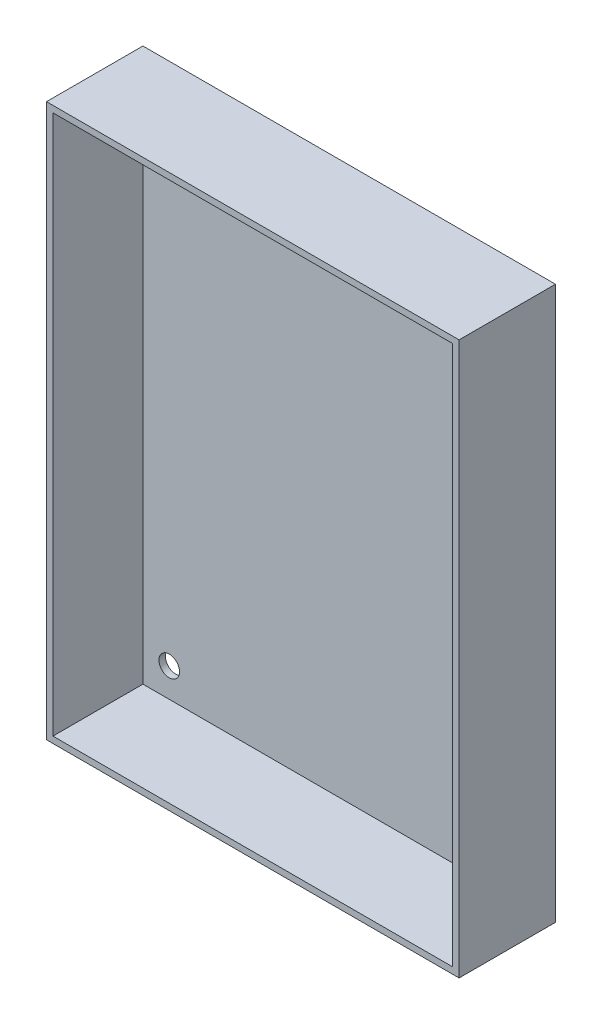
ISO-10303-21;
HEADER;
FILE_DESCRIPTION(('STEP AP214'),'2;1');
FILE_NAME('part.step','',(''),(''),'','','');
FILE_SCHEMA(('AUTOMOTIVE_DESIGN { 1 0 10303 214 1 1 1 1 }'));
ENDSEC;
DATA;
#1=APPLICATION_CONTEXT('core data for automotive mechanical design processes');
#2=APPLICATION_PROTOCOL_DEFINITION('international standard','automotive_design',2000,#1);
#3=PRODUCT_CONTEXT('',#1,'mechanical');
#4=PRODUCT('Part','Part','',(#3));
#5=PRODUCT_RELATED_PRODUCT_CATEGORY('part','',(#4));
#6=PRODUCT_DEFINITION_FORMATION('','',#4);
#7=PRODUCT_DEFINITION_CONTEXT('part definition',#1,'design');
#8=PRODUCT_DEFINITION('design','',#6,#7);
#9=PRODUCT_DEFINITION_SHAPE('','',#8);
#10=(LENGTH_UNIT() NAMED_UNIT(*) SI_UNIT(.MILLI.,.METRE.));
#11=(NAMED_UNIT(*) PLANE_ANGLE_UNIT() SI_UNIT($,.RADIAN.));
#12=(NAMED_UNIT(*) SI_UNIT($,.STERADIAN.) SOLID_ANGLE_UNIT());
#13=UNCERTAINTY_MEASURE_WITH_UNIT(LENGTH_MEASURE(1.E-05),#10,'distance_accuracy_value','');
#14=(GEOMETRIC_REPRESENTATION_CONTEXT(3) GLOBAL_UNCERTAINTY_ASSIGNED_CONTEXT((#13)) GLOBAL_UNIT_ASSIGNED_CONTEXT((#10,
#11,#12)) REPRESENTATION_CONTEXT('',''));
#15=CARTESIAN_POINT('',(0.,0.,0.));
#16=DIRECTION('',(0.,0.,1.));
#17=DIRECTION('',(1.,0.,0.));
#18=AXIS2_PLACEMENT_3D('',#15,#16,#17);
#19=CARTESIAN_POINT('',(-32.1,-43.,15.));
#20=DIRECTION('',(1.,0.,0.));
#21=DIRECTION('',(0.,0.,-1.));
#22=AXIS2_PLACEMENT_3D('',#19,#20,#21);
#23=PLANE('',#22);
#24=DIRECTION('',(0.,-1.,0.));
#25=VECTOR('',#24,1.);
#26=CARTESIAN_POINT('',(-32.1,-43.,0.));
#27=LINE('',#26,#25);
#28=CARTESIAN_POINT('',(-32.1,43.,0.));
#29=VERTEX_POINT('',#28);
#30=CARTESIAN_POINT('',(-32.1,-43.,0.));
#31=VERTEX_POINT('',#30);
#32=EDGE_CURVE('E147',#29,#31,#27,.T.);
#33=ORIENTED_EDGE('',*,*,#32,.T.);
#34=DIRECTION('',(0.,0.,-1.));
#35=VECTOR('',#34,1.);
#36=CARTESIAN_POINT('',(-32.1,-43.,15.));
#37=LINE('',#36,#35);
#38=CARTESIAN_POINT('',(-32.1,-43.,15.));
#39=VERTEX_POINT('',#38);
#40=EDGE_CURVE('E11',#39,#31,#37,.T.);
#41=ORIENTED_EDGE('',*,*,#40,.F.);
#42=DIRECTION('',(0.,-1.,0.));
#43=VECTOR('',#42,1.);
#44=CARTESIAN_POINT('',(-32.1,-43.,15.));
#45=LINE('',#44,#43);
#46=CARTESIAN_POINT('',(-32.1,43.,15.));
#47=VERTEX_POINT('',#46);
#48=EDGE_CURVE('E151',#47,#39,#45,.T.);
#49=ORIENTED_EDGE('',*,*,#48,.F.);
#50=DIRECTION('',(0.,0.,-1.));
#51=VECTOR('',#50,1.);
#52=CARTESIAN_POINT('',(-32.1,43.,15.));
#53=LINE('',#52,#51);
#54=EDGE_CURVE('E157',#47,#29,#53,.T.);
#55=ORIENTED_EDGE('',*,*,#54,.T.);
#56=EDGE_LOOP('',(#33,#41,#49,#55));
#57=FACE_BOUND('',#56,.T.);
#58=ADVANCED_FACE('F35',(#57),#23,.F.);
#59=CARTESIAN_POINT('',(32.1,-43.,15.));
#60=DIRECTION('',(0.,1.,0.));
#61=DIRECTION('',(-1.,0.,0.));
#62=AXIS2_PLACEMENT_3D('',#59,#60,#61);
#63=PLANE('',#62);
#64=DIRECTION('',(1.,0.,0.));
#65=VECTOR('',#64,1.);
#66=CARTESIAN_POINT('',(32.1,-43.,0.));
#67=LINE('',#66,#65);
#68=CARTESIAN_POINT('',(32.1,-43.,0.));
#69=VERTEX_POINT('',#68);
#70=EDGE_CURVE('E160',#31,#69,#67,.T.);
#71=ORIENTED_EDGE('',*,*,#70,.T.);
#72=DIRECTION('',(0.,0.,-1.));
#73=VECTOR('',#72,1.);
#74=CARTESIAN_POINT('',(32.1,-43.,15.));
#75=LINE('',#74,#73);
#76=CARTESIAN_POINT('',(32.1,-43.,15.));
#77=VERTEX_POINT('',#76);
#78=EDGE_CURVE('E42',#77,#69,#75,.T.);
#79=ORIENTED_EDGE('',*,*,#78,.F.);
#80=DIRECTION('',(1.,0.,0.));
#81=VECTOR('',#80,1.);
#82=CARTESIAN_POINT('',(32.1,-43.,15.));
#83=LINE('',#82,#81);
#84=EDGE_CURVE('E86',#39,#77,#83,.T.);
#85=ORIENTED_EDGE('',*,*,#84,.F.);
#86=ORIENTED_EDGE('',*,*,#40,.T.);
#87=EDGE_LOOP('',(#71,#79,#85,#86));
#88=FACE_BOUND('',#87,.T.);
#89=ADVANCED_FACE('F189',(#88),#63,.F.);
#90=CARTESIAN_POINT('',(32.1,-43.,15.));
#91=DIRECTION('',(-1.,0.,0.));
#92=DIRECTION('',(0.,0.,1.));
#93=AXIS2_PLACEMENT_3D('',#90,#91,#92);
#94=PLANE('',#93);
#95=DIRECTION('',(0.,1.,0.));
#96=VECTOR('',#95,1.);
#97=CARTESIAN_POINT('',(32.1,-43.,0.));
#98=LINE('',#97,#96);
#99=CARTESIAN_POINT('',(32.1,43.,0.));
#100=VERTEX_POINT('',#99);
#101=EDGE_CURVE('E162',#69,#100,#98,.T.);
#102=ORIENTED_EDGE('',*,*,#101,.T.);
#103=DIRECTION('',(0.,0.,-1.));
#104=VECTOR('',#103,1.);
#105=CARTESIAN_POINT('',(32.1,43.,15.));
#106=LINE('',#105,#104);
#107=CARTESIAN_POINT('',(32.1,43.,15.));
#108=VERTEX_POINT('',#107);
#109=EDGE_CURVE('E166',#108,#100,#106,.T.);
#110=ORIENTED_EDGE('',*,*,#109,.F.);
#111=DIRECTION('',(0.,1.,0.));
#112=VECTOR('',#111,1.);
#113=CARTESIAN_POINT('',(32.1,-43.,15.));
#114=LINE('',#113,#112);
#115=EDGE_CURVE('E154',#77,#108,#114,.T.);
#116=ORIENTED_EDGE('',*,*,#115,.F.);
#117=ORIENTED_EDGE('',*,*,#78,.T.);
#118=EDGE_LOOP('',(#102,#110,#116,#117));
#119=FACE_BOUND('',#118,.T.);
#120=ADVANCED_FACE('F171',(#119),#94,.F.);
#121=CARTESIAN_POINT('',(32.1,43.,15.));
#122=DIRECTION('',(0.,-1.,0.));
#123=DIRECTION('',(1.,0.,0.));
#124=AXIS2_PLACEMENT_3D('',#121,#122,#123);
#125=PLANE('',#124);
#126=DIRECTION('',(-1.,0.,0.));
#127=VECTOR('',#126,1.);
#128=CARTESIAN_POINT('',(32.1,43.,0.));
#129=LINE('',#128,#127);
#130=EDGE_CURVE('E79',#100,#29,#129,.T.);
#131=ORIENTED_EDGE('',*,*,#130,.T.);
#132=ORIENTED_EDGE('',*,*,#54,.F.);
#133=DIRECTION('',(-1.,0.,0.));
#134=VECTOR('',#133,1.);
#135=CARTESIAN_POINT('',(32.1,43.,15.));
#136=LINE('',#135,#134);
#137=EDGE_CURVE('E58',#108,#47,#136,.T.);
#138=ORIENTED_EDGE('',*,*,#137,.F.);
#139=ORIENTED_EDGE('',*,*,#109,.T.);
#140=EDGE_LOOP('',(#131,#132,#138,#139));
#141=FACE_BOUND('',#140,.T.);
#142=ADVANCED_FACE('F179',(#141),#125,.F.);
#143=CARTESIAN_POINT('',(0.,0.,15.));
#144=DIRECTION('',(0.,0.,1.));
#145=DIRECTION('',(1.,0.,0.));
#146=AXIS2_PLACEMENT_3D('',#143,#144,#145);
#147=PLANE('',#146);
#148=DIRECTION('',(0.,-1.,0.));
#149=VECTOR('',#148,1.);
#150=CARTESIAN_POINT('',(-31.1,-42.,15.));
#151=LINE('',#150,#149);
#152=CARTESIAN_POINT('',(-31.1,42.,15.));
#153=VERTEX_POINT('',#152);
#154=CARTESIAN_POINT('',(-31.1,-42.,15.));
#155=VERTEX_POINT('',#154);
#156=EDGE_CURVE('E49',#153,#155,#151,.T.);
#157=ORIENTED_EDGE('',*,*,#156,.F.);
#158=DIRECTION('',(-1.,0.,0.));
#159=VECTOR('',#158,1.);
#160=CARTESIAN_POINT('',(31.1,42.,15.));
#161=LINE('',#160,#159);
#162=CARTESIAN_POINT('',(31.1,42.,15.));
#163=VERTEX_POINT('',#162);
#164=EDGE_CURVE('E128',#163,#153,#161,.T.);
#165=ORIENTED_EDGE('',*,*,#164,.F.);
#166=DIRECTION('',(0.,1.,0.));
#167=VECTOR('',#166,1.);
#168=CARTESIAN_POINT('',(31.1,-42.,15.));
#169=LINE('',#168,#167);
#170=CARTESIAN_POINT('',(31.1,-42.,15.));
#171=VERTEX_POINT('',#170);
#172=EDGE_CURVE('E131',#171,#163,#169,.T.);
#173=ORIENTED_EDGE('',*,*,#172,.F.);
#174=DIRECTION('',(1.,0.,0.));
#175=VECTOR('',#174,1.);
#176=CARTESIAN_POINT('',(31.1,-42.,15.));
#177=LINE('',#176,#175);
#178=EDGE_CURVE('E140',#155,#171,#177,.T.);
#179=ORIENTED_EDGE('',*,*,#178,.F.);
#180=EDGE_LOOP('',(#157,#165,#173,#179));
#181=FACE_BOUND('',#180,.T.);
#182=ORIENTED_EDGE('',*,*,#48,.T.);
#183=ORIENTED_EDGE('',*,*,#84,.T.);
#184=ORIENTED_EDGE('',*,*,#115,.T.);
#185=ORIENTED_EDGE('',*,*,#137,.T.);
#186=EDGE_LOOP('',(#182,#183,#184,#185));
#187=FACE_BOUND('',#186,.T.);
#188=ADVANCED_FACE('F181',(#181,#187),#147,.T.);
#189=CARTESIAN_POINT('',(0.,0.,0.));
#190=DIRECTION('',(0.,0.,1.));
#191=DIRECTION('',(1.,0.,0.));
#192=AXIS2_PLACEMENT_3D('',#189,#190,#191);
#193=PLANE('',#192);
#194=CARTESIAN_POINT('',(-27.,37.5,0.));
#195=DIRECTION('',(0.,0.,-1.));
#196=DIRECTION('',(-1.,0.,0.));
#197=AXIS2_PLACEMENT_3D('',#194,#195,#196);
#198=CIRCLE('',#197,1.6);
#199=CARTESIAN_POINT('',(-28.6,37.5,0.));
#200=VERTEX_POINT('',#199);
#201=EDGE_CURVE('E315',#200,#200,#198,.T.);
#202=ORIENTED_EDGE('',*,*,#201,.F.);
#203=EDGE_LOOP('',(#202));
#204=FACE_BOUND('',#203,.T.);
#205=CARTESIAN_POINT('',(27.,-37.5,0.));
#206=DIRECTION('',(0.,0.,-1.));
#207=DIRECTION('',(-1.,0.,0.));
#208=AXIS2_PLACEMENT_3D('',#205,#206,#207);
#209=CIRCLE('',#208,1.6);
#210=CARTESIAN_POINT('',(25.4,-37.5,0.));
#211=VERTEX_POINT('',#210);
#212=EDGE_CURVE('E320',#211,#211,#209,.T.);
#213=ORIENTED_EDGE('',*,*,#212,.F.);
#214=EDGE_LOOP('',(#213));
#215=FACE_BOUND('',#214,.T.);
#216=CARTESIAN_POINT('',(-27.,-37.5,0.));
#217=DIRECTION('',(0.,0.,-1.));
#218=DIRECTION('',(-1.,0.,0.));
#219=AXIS2_PLACEMENT_3D('',#216,#217,#218);
#220=CIRCLE('',#219,1.6);
#221=CARTESIAN_POINT('',(-28.6,-37.5,0.));
#222=VERTEX_POINT('',#221);
#223=EDGE_CURVE('E336',#222,#222,#220,.T.);
#224=ORIENTED_EDGE('',*,*,#223,.F.);
#225=EDGE_LOOP('',(#224));
#226=FACE_BOUND('',#225,.T.);
#227=CARTESIAN_POINT('',(27.,37.5,0.));
#228=DIRECTION('',(0.,0.,-1.));
#229=DIRECTION('',(-1.,0.,0.));
#230=AXIS2_PLACEMENT_3D('',#227,#228,#229);
#231=CIRCLE('',#230,1.6);
#232=CARTESIAN_POINT('',(25.4,37.5,0.));
#233=VERTEX_POINT('',#232);
#234=EDGE_CURVE('E134',#233,#233,#231,.T.);
#235=ORIENTED_EDGE('',*,*,#234,.F.);
#236=EDGE_LOOP('',(#235));
#237=FACE_BOUND('',#236,.T.);
#238=ORIENTED_EDGE('',*,*,#32,.F.);
#239=ORIENTED_EDGE('',*,*,#130,.F.);
#240=ORIENTED_EDGE('',*,*,#101,.F.);
#241=ORIENTED_EDGE('',*,*,#70,.F.);
#242=EDGE_LOOP('',(#238,#239,#240,#241));
#243=FACE_BOUND('',#242,.T.);
#244=ADVANCED_FACE('F175',(#204,#215,#226,#237,#243),#193,.F.);
#245=CARTESIAN_POINT('',(-31.1,-42.,0.999999999999999));
#246=DIRECTION('',(-1.,0.,0.));
#247=DIRECTION('',(0.,0.,1.));
#248=AXIS2_PLACEMENT_3D('',#245,#246,#247);
#249=PLANE('',#248);
#250=ORIENTED_EDGE('',*,*,#156,.T.);
#251=DIRECTION('',(0.,0.,1.));
#252=VECTOR('',#251,1.);
#253=CARTESIAN_POINT('',(-31.1,-42.,0.999999999999999));
#254=LINE('',#253,#252);
#255=CARTESIAN_POINT('',(-31.1,-42.,0.999999999999999));
#256=VERTEX_POINT('',#255);
#257=EDGE_CURVE('E106',#256,#155,#254,.T.);
#258=ORIENTED_EDGE('',*,*,#257,.F.);
#259=DIRECTION('',(0.,-1.,0.));
#260=VECTOR('',#259,1.);
#261=CARTESIAN_POINT('',(-31.1,-42.,0.999999999999999));
#262=LINE('',#261,#260);
#263=CARTESIAN_POINT('',(-31.1,42.,0.999999999999999));
#264=VERTEX_POINT('',#263);
#265=EDGE_CURVE('E110',#264,#256,#262,.T.);
#266=ORIENTED_EDGE('',*,*,#265,.F.);
#267=DIRECTION('',(0.,0.,1.));
#268=VECTOR('',#267,1.);
#269=CARTESIAN_POINT('',(-31.1,42.,0.999999999999999));
#270=LINE('',#269,#268);
#271=EDGE_CURVE('E145',#264,#153,#270,.T.);
#272=ORIENTED_EDGE('',*,*,#271,.T.);
#273=EDGE_LOOP('',(#250,#258,#266,#272));
#274=FACE_BOUND('',#273,.T.);
#275=ADVANCED_FACE('F108',(#274),#249,.F.);
#276=CARTESIAN_POINT('',(31.1,42.,0.999999999999999));
#277=DIRECTION('',(0.,1.,0.));
#278=DIRECTION('',(-1.,0.,0.));
#279=AXIS2_PLACEMENT_3D('',#276,#277,#278);
#280=PLANE('',#279);
#281=ORIENTED_EDGE('',*,*,#164,.T.);
#282=ORIENTED_EDGE('',*,*,#271,.F.);
#283=DIRECTION('',(-1.,0.,0.));
#284=VECTOR('',#283,1.);
#285=CARTESIAN_POINT('',(31.1,42.,0.999999999999999));
#286=LINE('',#285,#284);
#287=CARTESIAN_POINT('',(31.1,42.,0.999999999999999));
#288=VERTEX_POINT('',#287);
#289=EDGE_CURVE('E116',#288,#264,#286,.T.);
#290=ORIENTED_EDGE('',*,*,#289,.F.);
#291=DIRECTION('',(0.,0.,1.));
#292=VECTOR('',#291,1.);
#293=CARTESIAN_POINT('',(31.1,42.,0.999999999999999));
#294=LINE('',#293,#292);
#295=EDGE_CURVE('E148',#288,#163,#294,.T.);
#296=ORIENTED_EDGE('',*,*,#295,.T.);
#297=EDGE_LOOP('',(#281,#282,#290,#296));
#298=FACE_BOUND('',#297,.T.);
#299=ADVANCED_FACE('F223',(#298),#280,.F.);
#300=CARTESIAN_POINT('',(31.1,-42.,0.999999999999999));
#301=DIRECTION('',(1.,0.,0.));
#302=DIRECTION('',(0.,0.,-1.));
#303=AXIS2_PLACEMENT_3D('',#300,#301,#302);
#304=PLANE('',#303);
#305=ORIENTED_EDGE('',*,*,#172,.T.);
#306=ORIENTED_EDGE('',*,*,#295,.F.);
#307=DIRECTION('',(0.,1.,0.));
#308=VECTOR('',#307,1.);
#309=CARTESIAN_POINT('',(31.1,-42.,0.999999999999999));
#310=LINE('',#309,#308);
#311=CARTESIAN_POINT('',(31.1,-42.,0.999999999999999));
#312=VERTEX_POINT('',#311);
#313=EDGE_CURVE('E124',#312,#288,#310,.T.);
#314=ORIENTED_EDGE('',*,*,#313,.F.);
#315=DIRECTION('',(0.,0.,1.));
#316=VECTOR('',#315,1.);
#317=CARTESIAN_POINT('',(31.1,-42.,0.999999999999999));
#318=LINE('',#317,#316);
#319=EDGE_CURVE('E115',#312,#171,#318,.T.);
#320=ORIENTED_EDGE('',*,*,#319,.T.);
#321=EDGE_LOOP('',(#305,#306,#314,#320));
#322=FACE_BOUND('',#321,.T.);
#323=ADVANCED_FACE('F232',(#322),#304,.F.);
#324=CARTESIAN_POINT('',(31.1,-42.,0.999999999999999));
#325=DIRECTION('',(0.,-1.,0.));
#326=DIRECTION('',(1.,0.,0.));
#327=AXIS2_PLACEMENT_3D('',#324,#325,#326);
#328=PLANE('',#327);
#329=ORIENTED_EDGE('',*,*,#178,.T.);
#330=ORIENTED_EDGE('',*,*,#319,.F.);
#331=DIRECTION('',(1.,0.,0.));
#332=VECTOR('',#331,1.);
#333=CARTESIAN_POINT('',(31.1,-42.,0.999999999999999));
#334=LINE('',#333,#332);
#335=EDGE_CURVE('E119',#256,#312,#334,.T.);
#336=ORIENTED_EDGE('',*,*,#335,.F.);
#337=ORIENTED_EDGE('',*,*,#257,.T.);
#338=EDGE_LOOP('',(#329,#330,#336,#337));
#339=FACE_BOUND('',#338,.T.);
#340=ADVANCED_FACE('F120',(#339),#328,.F.);
#341=CARTESIAN_POINT('',(0.,0.,0.999999999999999));
#342=DIRECTION('',(0.,0.,1.));
#343=DIRECTION('',(1.,0.,0.));
#344=AXIS2_PLACEMENT_3D('',#341,#342,#343);
#345=PLANE('',#344);
#346=CARTESIAN_POINT('',(-27.,37.5,1.));
#347=DIRECTION('',(0.,0.,-1.));
#348=DIRECTION('',(-1.,0.,0.));
#349=AXIS2_PLACEMENT_3D('',#346,#347,#348);
#350=CIRCLE('',#349,1.6);
#351=CARTESIAN_POINT('',(-28.6,37.5,1.));
#352=VERTEX_POINT('',#351);
#353=EDGE_CURVE('E312',#352,#352,#350,.T.);
#354=ORIENTED_EDGE('',*,*,#353,.T.);
#355=EDGE_LOOP('',(#354));
#356=FACE_BOUND('',#355,.T.);
#357=CARTESIAN_POINT('',(27.,-37.5,1.));
#358=DIRECTION('',(0.,0.,-1.));
#359=DIRECTION('',(-1.,0.,0.));
#360=AXIS2_PLACEMENT_3D('',#357,#358,#359);
#361=CIRCLE('',#360,1.6);
#362=CARTESIAN_POINT('',(25.4,-37.5,1.));
#363=VERTEX_POINT('',#362);
#364=EDGE_CURVE('E316',#363,#363,#361,.T.);
#365=ORIENTED_EDGE('',*,*,#364,.T.);
#366=EDGE_LOOP('',(#365));
#367=FACE_BOUND('',#366,.T.);
#368=CARTESIAN_POINT('',(-27.,-37.5,1.));
#369=DIRECTION('',(0.,0.,-1.));
#370=DIRECTION('',(-1.,0.,0.));
#371=AXIS2_PLACEMENT_3D('',#368,#369,#370);
#372=CIRCLE('',#371,1.6);
#373=CARTESIAN_POINT('',(-28.6,-37.5,1.));
#374=VERTEX_POINT('',#373);
#375=EDGE_CURVE('E325',#374,#374,#372,.T.);
#376=ORIENTED_EDGE('',*,*,#375,.T.);
#377=EDGE_LOOP('',(#376));
#378=FACE_BOUND('',#377,.T.);
#379=CARTESIAN_POINT('',(27.,37.5,1.));
#380=DIRECTION('',(0.,0.,-1.));
#381=DIRECTION('',(-1.,0.,0.));
#382=AXIS2_PLACEMENT_3D('',#379,#380,#381);
#383=CIRCLE('',#382,1.6);
#384=CARTESIAN_POINT('',(25.4,37.5,1.));
#385=VERTEX_POINT('',#384);
#386=EDGE_CURVE('E141',#385,#385,#383,.T.);
#387=ORIENTED_EDGE('',*,*,#386,.T.);
#388=EDGE_LOOP('',(#387));
#389=FACE_BOUND('',#388,.T.);
#390=ORIENTED_EDGE('',*,*,#265,.T.);
#391=ORIENTED_EDGE('',*,*,#335,.T.);
#392=ORIENTED_EDGE('',*,*,#313,.T.);
#393=ORIENTED_EDGE('',*,*,#289,.T.);
#394=EDGE_LOOP('',(#390,#391,#392,#393));
#395=FACE_BOUND('',#394,.T.);
#396=ADVANCED_FACE('F126',(#356,#367,#378,#389,#395),#345,.T.);
#397=CARTESIAN_POINT('',(27.,37.5,1.));
#398=DIRECTION('',(0.,0.,-1.));
#399=DIRECTION('',(-1.,0.,0.));
#400=AXIS2_PLACEMENT_3D('',#397,#398,#399);
#401=CYLINDRICAL_SURFACE('',#400,1.6);
#402=ORIENTED_EDGE('',*,*,#386,.F.);
#403=EDGE_LOOP('',(#402));
#404=FACE_BOUND('',#403,.T.);
#405=ORIENTED_EDGE('',*,*,#234,.T.);
#406=EDGE_LOOP('',(#405));
#407=FACE_BOUND('',#406,.T.);
#408=ADVANCED_FACE('F265',(#404,#407),#401,.F.);
#409=CARTESIAN_POINT('',(-27.,-37.5,1.));
#410=DIRECTION('',(0.,0.,-1.));
#411=DIRECTION('',(-1.,0.,0.));
#412=AXIS2_PLACEMENT_3D('',#409,#410,#411);
#413=CYLINDRICAL_SURFACE('',#412,1.6);
#414=ORIENTED_EDGE('',*,*,#375,.F.);
#415=EDGE_LOOP('',(#414));
#416=FACE_BOUND('',#415,.T.);
#417=ORIENTED_EDGE('',*,*,#223,.T.);
#418=EDGE_LOOP('',(#417));
#419=FACE_BOUND('',#418,.T.);
#420=ADVANCED_FACE('F275',(#416,#419),#413,.F.);
#421=CARTESIAN_POINT('',(27.,-37.5,1.));
#422=DIRECTION('',(0.,0.,-1.));
#423=DIRECTION('',(-1.,0.,0.));
#424=AXIS2_PLACEMENT_3D('',#421,#422,#423);
#425=CYLINDRICAL_SURFACE('',#424,1.6);
#426=ORIENTED_EDGE('',*,*,#364,.F.);
#427=EDGE_LOOP('',(#426));
#428=FACE_BOUND('',#427,.T.);
#429=ORIENTED_EDGE('',*,*,#212,.T.);
#430=EDGE_LOOP('',(#429));
#431=FACE_BOUND('',#430,.T.);
#432=ADVANCED_FACE('F285',(#428,#431),#425,.F.);
#433=CARTESIAN_POINT('',(-27.,37.5,1.));
#434=DIRECTION('',(0.,0.,-1.));
#435=DIRECTION('',(-1.,0.,0.));
#436=AXIS2_PLACEMENT_3D('',#433,#434,#435);
#437=CYLINDRICAL_SURFACE('',#436,1.6);
#438=ORIENTED_EDGE('',*,*,#353,.F.);
#439=EDGE_LOOP('',(#438));
#440=FACE_BOUND('',#439,.T.);
#441=ORIENTED_EDGE('',*,*,#201,.T.);
#442=EDGE_LOOP('',(#441));
#443=FACE_BOUND('',#442,.T.);
#444=ADVANCED_FACE('F295',(#440,#443),#437,.F.);
#445=CLOSED_SHELL('',(#58,#89,#120,#142,#188,#244,#275,#299,#323,#340,#396,#408,#420,#432,#444));
#446=MANIFOLD_SOLID_BREP('B2',#445);
#447=ADVANCED_BREP_SHAPE_REPRESENTATION('',(#18,#446),#14);
#448=SHAPE_DEFINITION_REPRESENTATION(#9,#447);
ENDSEC;
END-ISO-10303-21;
